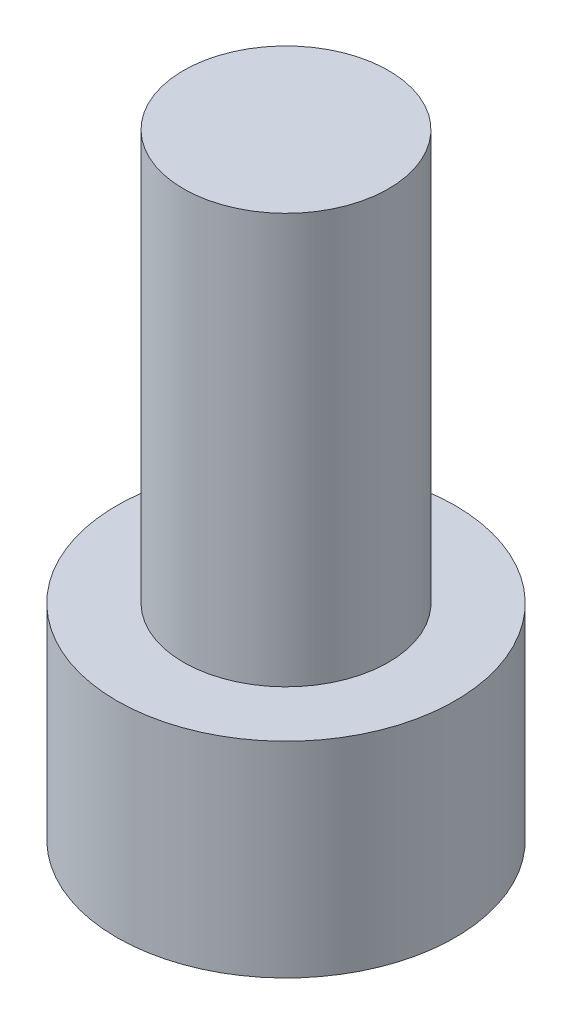
ISO-10303-21;
HEADER;
FILE_DESCRIPTION(('STEP AP214'),'2;1');
FILE_NAME('part.step','',(''),(''),'','','');
FILE_SCHEMA(('AUTOMOTIVE_DESIGN { 1 0 10303 214 1 1 1 1 }'));
ENDSEC;
DATA;
#1=APPLICATION_CONTEXT('core data for automotive mechanical design processes');
#2=APPLICATION_PROTOCOL_DEFINITION('international standard','automotive_design',2000,#1);
#3=PRODUCT_CONTEXT('',#1,'mechanical');
#4=PRODUCT('Part','Part','',(#3));
#5=PRODUCT_RELATED_PRODUCT_CATEGORY('part','',(#4));
#6=PRODUCT_DEFINITION_FORMATION('','',#4);
#7=PRODUCT_DEFINITION_CONTEXT('part definition',#1,'design');
#8=PRODUCT_DEFINITION('design','',#6,#7);
#9=PRODUCT_DEFINITION_SHAPE('','',#8);
#10=(LENGTH_UNIT() NAMED_UNIT(*) SI_UNIT(.MILLI.,.METRE.));
#11=(NAMED_UNIT(*) PLANE_ANGLE_UNIT() SI_UNIT($,.RADIAN.));
#12=(NAMED_UNIT(*) SI_UNIT($,.STERADIAN.) SOLID_ANGLE_UNIT());
#13=UNCERTAINTY_MEASURE_WITH_UNIT(LENGTH_MEASURE(1.E-05),#10,'distance_accuracy_value','');
#14=(GEOMETRIC_REPRESENTATION_CONTEXT(3) GLOBAL_UNCERTAINTY_ASSIGNED_CONTEXT((#13)) GLOBAL_UNIT_ASSIGNED_CONTEXT((#10,
#11,#12)) REPRESENTATION_CONTEXT('',''));
#15=CARTESIAN_POINT('',(0.,0.,0.));
#16=DIRECTION('',(0.,0.,1.));
#17=DIRECTION('',(1.,0.,0.));
#18=AXIS2_PLACEMENT_3D('',#15,#16,#17);
#19=CARTESIAN_POINT('',(0.,8.,0.));
#20=DIRECTION('',(0.,-1.,0.));
#21=DIRECTION('',(0.,0.,-1.));
#22=AXIS2_PLACEMENT_3D('',#19,#20,#21);
#23=CYLINDRICAL_SURFACE('',#22,6.6);
#24=CARTESIAN_POINT('',(0.,8.,0.));
#25=DIRECTION('',(0.,1.,0.));
#26=DIRECTION('',(0.,0.,1.));
#27=AXIS2_PLACEMENT_3D('',#24,#25,#26);
#28=CIRCLE('',#27,6.6);
#29=CARTESIAN_POINT('',(0.,8.,6.6));
#30=VERTEX_POINT('',#29);
#31=EDGE_CURVE('E51',#30,#30,#28,.T.);
#32=ORIENTED_EDGE('',*,*,#31,.F.);
#33=EDGE_LOOP('',(#32));
#34=FACE_BOUND('',#33,.T.);
#35=CARTESIAN_POINT('',(0.,0.,0.));
#36=DIRECTION('',(0.,1.,0.));
#37=DIRECTION('',(0.,0.,1.));
#38=AXIS2_PLACEMENT_3D('',#35,#36,#37);
#39=CIRCLE('',#38,6.6);
#40=CARTESIAN_POINT('',(0.,0.,6.6));
#41=VERTEX_POINT('',#40);
#42=EDGE_CURVE('E46',#41,#41,#39,.T.);
#43=ORIENTED_EDGE('',*,*,#42,.T.);
#44=EDGE_LOOP('',(#43));
#45=FACE_BOUND('',#44,.T.);
#46=ADVANCED_FACE('F43',(#34,#45),#23,.T.);
#47=CARTESIAN_POINT('',(0.,8.,0.));
#48=DIRECTION('',(0.,1.,0.));
#49=DIRECTION('',(0.,0.,1.));
#50=AXIS2_PLACEMENT_3D('',#47,#48,#49);
#51=PLANE('',#50);
#52=CARTESIAN_POINT('',(0.,8.,0.));
#53=DIRECTION('',(0.,1.,0.));
#54=DIRECTION('',(0.,0.,1.));
#55=AXIS2_PLACEMENT_3D('',#52,#53,#54);
#56=CIRCLE('',#55,4.);
#57=CARTESIAN_POINT('',(0.,8.,4.));
#58=VERTEX_POINT('',#57);
#59=EDGE_CURVE('E11',#58,#58,#56,.T.);
#60=ORIENTED_EDGE('',*,*,#59,.F.);
#61=EDGE_LOOP('',(#60));
#62=FACE_BOUND('',#61,.T.);
#63=ORIENTED_EDGE('',*,*,#31,.T.);
#64=EDGE_LOOP('',(#63));
#65=FACE_BOUND('',#64,.T.);
#66=ADVANCED_FACE('F162',(#62,#65),#51,.T.);
#67=CARTESIAN_POINT('',(0.,0.,0.));
#68=DIRECTION('',(0.,1.,0.));
#69=DIRECTION('',(0.,0.,1.));
#70=AXIS2_PLACEMENT_3D('',#67,#68,#69);
#71=PLANE('',#70);
#72=DIRECTION('',(0.103212090845622,0.,0.99465937099254));
#73=VECTOR('',#72,1.);
#74=CARTESIAN_POINT('',(2.80520952767759,0.,-2.03243683932045));
#75=LINE('',#74,#73);
#76=CARTESIAN_POINT('',(2.80520952767759,0.,-2.03243683932045));
#77=VERTEX_POINT('',#76);
#78=CARTESIAN_POINT('',(3.16274669827765,0.,1.41316429424671));
#79=VERTEX_POINT('',#78);
#80=EDGE_CURVE('E132',#77,#79,#75,.T.);
#81=ORIENTED_EDGE('',*,*,#80,.F.);
#82=DIRECTION('',(0.913006328814601,0.,0.407945392846253));
#83=VECTOR('',#82,1.);
#84=CARTESIAN_POINT('',(-0.357537170600066,0.,-3.44560113356716));
#85=LINE('',#84,#83);
#86=CARTESIAN_POINT('',(-0.357537170600066,0.,-3.44560113356716));
#87=VERTEX_POINT('',#86);
#88=EDGE_CURVE('E56',#87,#77,#85,.T.);
#89=ORIENTED_EDGE('',*,*,#88,.F.);
#90=DIRECTION('',(0.809794237968979,0.,-0.586713978146287));
#91=VECTOR('',#90,1.);
#92=CARTESIAN_POINT('',(-3.16274669827765,0.,-1.41316429424671));
#93=LINE('',#92,#91);
#94=CARTESIAN_POINT('',(-3.16274669827765,0.,-1.41316429424671));
#95=VERTEX_POINT('',#94);
#96=EDGE_CURVE('E142',#95,#87,#93,.T.);
#97=ORIENTED_EDGE('',*,*,#96,.F.);
#98=DIRECTION('',(-0.103212090845623,0.,-0.99465937099254));
#99=VECTOR('',#98,1.);
#100=CARTESIAN_POINT('',(-2.80520952767759,0.,2.03243683932045));
#101=LINE('',#100,#99);
#102=CARTESIAN_POINT('',(-2.80520952767759,0.,2.03243683932045));
#103=VERTEX_POINT('',#102);
#104=EDGE_CURVE('E139',#103,#95,#101,.T.);
#105=ORIENTED_EDGE('',*,*,#104,.F.);
#106=DIRECTION('',(-0.913006328814601,0.,-0.407945392846253));
#107=VECTOR('',#106,1.);
#108=CARTESIAN_POINT('',(0.357537170600067,0.,3.44560113356716));
#109=LINE('',#108,#107);
#110=CARTESIAN_POINT('',(0.357537170600067,0.,3.44560113356716));
#111=VERTEX_POINT('',#110);
#112=EDGE_CURVE('E110',#111,#103,#109,.T.);
#113=ORIENTED_EDGE('',*,*,#112,.F.);
#114=DIRECTION('',(-0.809794237968979,0.,0.586713978146287));
#115=VECTOR('',#114,1.);
#116=CARTESIAN_POINT('',(3.16274669827765,0.,1.41316429424671));
#117=LINE('',#116,#115);
#118=EDGE_CURVE('E136',#79,#111,#117,.T.);
#119=ORIENTED_EDGE('',*,*,#118,.F.);
#120=EDGE_LOOP('',(#81,#89,#97,#105,#113,#119));
#121=FACE_BOUND('',#120,.T.);
#122=ORIENTED_EDGE('',*,*,#42,.F.);
#123=EDGE_LOOP('',(#122));
#124=FACE_BOUND('',#123,.T.);
#125=ADVANCED_FACE('F159',(#121,#124),#71,.F.);
#126=CARTESIAN_POINT('',(0.,24.,0.));
#127=DIRECTION('',(0.,-1.,0.));
#128=DIRECTION('',(0.,0.,-1.));
#129=AXIS2_PLACEMENT_3D('',#126,#127,#128);
#130=CYLINDRICAL_SURFACE('',#129,4.);
#131=CARTESIAN_POINT('',(0.,24.,0.));
#132=DIRECTION('',(0.,1.,0.));
#133=DIRECTION('',(0.,0.,1.));
#134=AXIS2_PLACEMENT_3D('',#131,#132,#133);
#135=CIRCLE('',#134,4.);
#136=CARTESIAN_POINT('',(0.,24.,4.));
#137=VERTEX_POINT('',#136);
#138=EDGE_CURVE('E148',#137,#137,#135,.T.);
#139=ORIENTED_EDGE('',*,*,#138,.F.);
#140=EDGE_LOOP('',(#139));
#141=FACE_BOUND('',#140,.T.);
#142=ORIENTED_EDGE('',*,*,#59,.T.);
#143=EDGE_LOOP('',(#142));
#144=FACE_BOUND('',#143,.T.);
#145=ADVANCED_FACE('F165',(#141,#144),#130,.T.);
#146=CARTESIAN_POINT('',(0.,24.,0.));
#147=DIRECTION('',(0.,1.,0.));
#148=DIRECTION('',(0.,0.,1.));
#149=AXIS2_PLACEMENT_3D('',#146,#147,#148);
#150=PLANE('',#149);
#151=ORIENTED_EDGE('',*,*,#138,.T.);
#152=EDGE_LOOP('',(#151));
#153=FACE_BOUND('',#152,.T.);
#154=ADVANCED_FACE('F168',(#153),#150,.T.);
#155=CARTESIAN_POINT('',(-0.357537170600066,4.,-3.44560113356716));
#156=DIRECTION('',(0.407945392846253,0.,-0.913006328814602));
#157=DIRECTION('',(-0.913006328814602,0.,-0.407945392846253));
#158=AXIS2_PLACEMENT_3D('',#155,#156,#157);
#159=PLANE('',#158);
#160=ORIENTED_EDGE('',*,*,#88,.T.);
#161=DIRECTION('',(0.,-1.,0.));
#162=VECTOR('',#161,1.);
#163=CARTESIAN_POINT('',(2.80520952767759,4.,-2.03243683932045));
#164=LINE('',#163,#162);
#165=CARTESIAN_POINT('',(2.80520952767759,4.,-2.03243683932045));
#166=VERTEX_POINT('',#165);
#167=EDGE_CURVE('E90',#166,#77,#164,.T.);
#168=ORIENTED_EDGE('',*,*,#167,.F.);
#169=DIRECTION('',(0.913006328814601,0.,0.407945392846253));
#170=VECTOR('',#169,1.);
#171=CARTESIAN_POINT('',(-0.357537170600066,4.,-3.44560113356716));
#172=LINE('',#171,#170);
#173=CARTESIAN_POINT('',(-0.357537170600066,4.,-3.44560113356716));
#174=VERTEX_POINT('',#173);
#175=EDGE_CURVE('E145',#174,#166,#172,.T.);
#176=ORIENTED_EDGE('',*,*,#175,.F.);
#177=DIRECTION('',(0.,-1.,0.));
#178=VECTOR('',#177,1.);
#179=CARTESIAN_POINT('',(-0.357537170600066,4.,-3.44560113356716));
#180=LINE('',#179,#178);
#181=EDGE_CURVE('E70',#174,#87,#180,.T.);
#182=ORIENTED_EDGE('',*,*,#181,.T.);
#183=EDGE_LOOP('',(#160,#168,#176,#182));
#184=FACE_BOUND('',#183,.T.);
#185=ADVANCED_FACE('F196',(#184),#159,.F.);
#186=CARTESIAN_POINT('',(-3.16274669827765,4.,-1.41316429424671));
#187=DIRECTION('',(-0.586713978146287,0.,-0.809794237968979));
#188=DIRECTION('',(-0.809794237968979,0.,0.586713978146287));
#189=AXIS2_PLACEMENT_3D('',#186,#187,#188);
#190=PLANE('',#189);
#191=ORIENTED_EDGE('',*,*,#96,.T.);
#192=ORIENTED_EDGE('',*,*,#181,.F.);
#193=DIRECTION('',(0.809794237968979,0.,-0.586713978146287));
#194=VECTOR('',#193,1.);
#195=CARTESIAN_POINT('',(-3.16274669827765,4.,-1.41316429424671));
#196=LINE('',#195,#194);
#197=CARTESIAN_POINT('',(-3.16274669827765,4.,-1.41316429424671));
#198=VERTEX_POINT('',#197);
#199=EDGE_CURVE('E120',#198,#174,#196,.T.);
#200=ORIENTED_EDGE('',*,*,#199,.F.);
#201=DIRECTION('',(0.,-1.,0.));
#202=VECTOR('',#201,1.);
#203=CARTESIAN_POINT('',(-3.16274669827765,4.,-1.41316429424671));
#204=LINE('',#203,#202);
#205=EDGE_CURVE('E112',#198,#95,#204,.T.);
#206=ORIENTED_EDGE('',*,*,#205,.T.);
#207=EDGE_LOOP('',(#191,#192,#200,#206));
#208=FACE_BOUND('',#207,.T.);
#209=ADVANCED_FACE('F209',(#208),#190,.F.);
#210=CARTESIAN_POINT('',(-2.80520952767759,4.,2.03243683932045));
#211=DIRECTION('',(-0.99465937099254,0.,0.103212090845623));
#212=DIRECTION('',(0.103212090845623,0.,0.99465937099254));
#213=AXIS2_PLACEMENT_3D('',#210,#211,#212);
#214=PLANE('',#213);
#215=ORIENTED_EDGE('',*,*,#104,.T.);
#216=ORIENTED_EDGE('',*,*,#205,.F.);
#217=DIRECTION('',(-0.103212090845623,0.,-0.99465937099254));
#218=VECTOR('',#217,1.);
#219=CARTESIAN_POINT('',(-2.80520952767759,4.,2.03243683932045));
#220=LINE('',#219,#218);
#221=CARTESIAN_POINT('',(-2.80520952767759,4.,2.03243683932045));
#222=VERTEX_POINT('',#221);
#223=EDGE_CURVE('E113',#222,#198,#220,.T.);
#224=ORIENTED_EDGE('',*,*,#223,.F.);
#225=DIRECTION('',(0.,-1.,0.));
#226=VECTOR('',#225,1.);
#227=CARTESIAN_POINT('',(-2.80520952767759,4.,2.03243683932045));
#228=LINE('',#227,#226);
#229=EDGE_CURVE('E99',#222,#103,#228,.T.);
#230=ORIENTED_EDGE('',*,*,#229,.T.);
#231=EDGE_LOOP('',(#215,#216,#224,#230));
#232=FACE_BOUND('',#231,.T.);
#233=ADVANCED_FACE('F118',(#232),#214,.F.);
#234=CARTESIAN_POINT('',(0.357537170600067,4.,3.44560113356716));
#235=DIRECTION('',(-0.407945392846253,0.,0.913006328814602));
#236=DIRECTION('',(0.913006328814602,0.,0.407945392846253));
#237=AXIS2_PLACEMENT_3D('',#234,#235,#236);
#238=PLANE('',#237);
#239=ORIENTED_EDGE('',*,*,#112,.T.);
#240=ORIENTED_EDGE('',*,*,#229,.F.);
#241=DIRECTION('',(-0.913006328814601,0.,-0.407945392846253));
#242=VECTOR('',#241,1.);
#243=CARTESIAN_POINT('',(0.357537170600067,4.,3.44560113356716));
#244=LINE('',#243,#242);
#245=CARTESIAN_POINT('',(0.357537170600067,4.,3.44560113356716));
#246=VERTEX_POINT('',#245);
#247=EDGE_CURVE('E102',#246,#222,#244,.T.);
#248=ORIENTED_EDGE('',*,*,#247,.F.);
#249=DIRECTION('',(0.,-1.,0.));
#250=VECTOR('',#249,1.);
#251=CARTESIAN_POINT('',(0.357537170600067,4.,3.44560113356716));
#252=LINE('',#251,#250);
#253=EDGE_CURVE('E115',#246,#111,#252,.T.);
#254=ORIENTED_EDGE('',*,*,#253,.T.);
#255=EDGE_LOOP('',(#239,#240,#248,#254));
#256=FACE_BOUND('',#255,.T.);
#257=ADVANCED_FACE('F105',(#256),#238,.F.);
#258=CARTESIAN_POINT('',(3.16274669827765,4.,1.41316429424671));
#259=DIRECTION('',(0.586713978146287,0.,0.809794237968979));
#260=DIRECTION('',(0.809794237968979,0.,-0.586713978146287));
#261=AXIS2_PLACEMENT_3D('',#258,#259,#260);
#262=PLANE('',#261);
#263=ORIENTED_EDGE('',*,*,#118,.T.);
#264=ORIENTED_EDGE('',*,*,#253,.F.);
#265=DIRECTION('',(-0.809794237968979,0.,0.586713978146287));
#266=VECTOR('',#265,1.);
#267=CARTESIAN_POINT('',(3.16274669827765,4.,1.41316429424671));
#268=LINE('',#267,#266);
#269=CARTESIAN_POINT('',(3.16274669827765,4.,1.41316429424671));
#270=VERTEX_POINT('',#269);
#271=EDGE_CURVE('E124',#270,#246,#268,.T.);
#272=ORIENTED_EDGE('',*,*,#271,.F.);
#273=DIRECTION('',(0.,-1.,0.));
#274=VECTOR('',#273,1.);
#275=CARTESIAN_POINT('',(3.16274669827765,4.,1.41316429424671));
#276=LINE('',#275,#274);
#277=EDGE_CURVE('E149',#270,#79,#276,.T.);
#278=ORIENTED_EDGE('',*,*,#277,.T.);
#279=EDGE_LOOP('',(#263,#264,#272,#278));
#280=FACE_BOUND('',#279,.T.);
#281=ADVANCED_FACE('F234',(#280),#262,.F.);
#282=CARTESIAN_POINT('',(2.80520952767759,4.,-2.03243683932045));
#283=DIRECTION('',(0.99465937099254,0.,-0.103212090845622));
#284=DIRECTION('',(-0.103212090845622,0.,-0.99465937099254));
#285=AXIS2_PLACEMENT_3D('',#282,#283,#284);
#286=PLANE('',#285);
#287=ORIENTED_EDGE('',*,*,#80,.T.);
#288=ORIENTED_EDGE('',*,*,#277,.F.);
#289=DIRECTION('',(0.103212090845622,0.,0.99465937099254));
#290=VECTOR('',#289,1.);
#291=CARTESIAN_POINT('',(2.80520952767759,4.,-2.03243683932045));
#292=LINE('',#291,#290);
#293=EDGE_CURVE('E130',#166,#270,#292,.T.);
#294=ORIENTED_EDGE('',*,*,#293,.F.);
#295=ORIENTED_EDGE('',*,*,#167,.T.);
#296=EDGE_LOOP('',(#287,#288,#294,#295));
#297=FACE_BOUND('',#296,.T.);
#298=ADVANCED_FACE('F245',(#297),#286,.F.);
#299=CARTESIAN_POINT('',(0.,4.,0.));
#300=DIRECTION('',(0.,-1.,0.));
#301=DIRECTION('',(0.,0.,-1.));
#302=AXIS2_PLACEMENT_3D('',#299,#300,#301);
#303=PLANE('',#302);
#304=ORIENTED_EDGE('',*,*,#175,.T.);
#305=ORIENTED_EDGE('',*,*,#293,.T.);
#306=ORIENTED_EDGE('',*,*,#271,.T.);
#307=ORIENTED_EDGE('',*,*,#247,.T.);
#308=ORIENTED_EDGE('',*,*,#223,.T.);
#309=ORIENTED_EDGE('',*,*,#199,.T.);
#310=EDGE_LOOP('',(#304,#305,#306,#307,#308,#309));
#311=FACE_BOUND('',#310,.T.);
#312=ADVANCED_FACE('F125',(#311),#303,.T.);
#313=CLOSED_SHELL('',(#46,#66,#125,#145,#154,#185,#209,#233,#257,#281,#298,#312));
#314=MANIFOLD_SOLID_BREP('B2',#313);
#315=ADVANCED_BREP_SHAPE_REPRESENTATION('',(#18,#314),#14);
#316=SHAPE_DEFINITION_REPRESENTATION(#9,#315);
ENDSEC;
END-ISO-10303-21;
